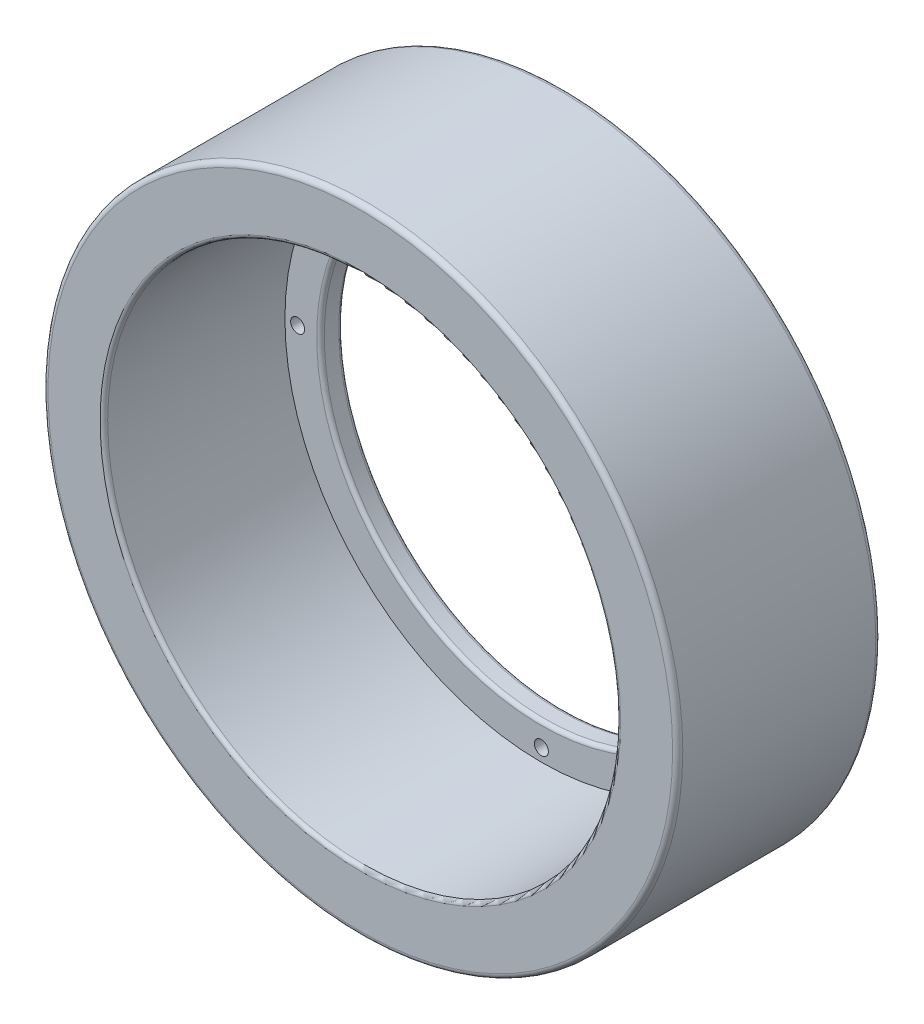
ISO-10303-21;
HEADER;
FILE_DESCRIPTION(('STEP AP214'),'2;1');
FILE_NAME('part.step','',(''),(''),'','','');
FILE_SCHEMA(('AUTOMOTIVE_DESIGN { 1 0 10303 214 1 1 1 1 }'));
ENDSEC;
DATA;
#1=APPLICATION_CONTEXT('core data for automotive mechanical design processes');
#2=APPLICATION_PROTOCOL_DEFINITION('international standard','automotive_design',2000,#1);
#3=PRODUCT_CONTEXT('',#1,'mechanical');
#4=PRODUCT('Part','Part','',(#3));
#5=PRODUCT_RELATED_PRODUCT_CATEGORY('part','',(#4));
#6=PRODUCT_DEFINITION_FORMATION('','',#4);
#7=PRODUCT_DEFINITION_CONTEXT('part definition',#1,'design');
#8=PRODUCT_DEFINITION('design','',#6,#7);
#9=PRODUCT_DEFINITION_SHAPE('','',#8);
#10=(LENGTH_UNIT() NAMED_UNIT(*) SI_UNIT(.MILLI.,.METRE.));
#11=(NAMED_UNIT(*) PLANE_ANGLE_UNIT() SI_UNIT($,.RADIAN.));
#12=(NAMED_UNIT(*) SI_UNIT($,.STERADIAN.) SOLID_ANGLE_UNIT());
#13=UNCERTAINTY_MEASURE_WITH_UNIT(LENGTH_MEASURE(1.E-05),#10,'distance_accuracy_value','');
#14=(GEOMETRIC_REPRESENTATION_CONTEXT(3) GLOBAL_UNCERTAINTY_ASSIGNED_CONTEXT((#13)) GLOBAL_UNIT_ASSIGNED_CONTEXT((#10,
#11,#12)) REPRESENTATION_CONTEXT('',''));
#15=CARTESIAN_POINT('',(0.,0.,0.));
#16=DIRECTION('',(0.,0.,1.));
#17=DIRECTION('',(1.,0.,0.));
#18=AXIS2_PLACEMENT_3D('',#15,#16,#17);
#19=CARTESIAN_POINT('',(0.,0.,80.));
#20=DIRECTION('',(0.,0.,1.));
#21=DIRECTION('',(1.,0.,0.));
#22=AXIS2_PLACEMENT_3D('',#19,#20,#21);
#23=PLANE('',#22);
#24=CARTESIAN_POINT('',(0.,0.,80.));
#25=DIRECTION('',(0.,0.,1.));
#26=DIRECTION('',(1.,0.,0.));
#27=AXIS2_PLACEMENT_3D('',#24,#25,#26);
#28=CIRCLE('',#27,102.5);
#29=CARTESIAN_POINT('',(102.5,0.,80.));
#30=VERTEX_POINT('',#29);
#31=EDGE_CURVE('E10',#30,#30,#28,.F.);
#32=ORIENTED_EDGE('',*,*,#31,.T.);
#33=EDGE_LOOP('',(#32));
#34=FACE_BOUND('',#33,.T.);
#35=CARTESIAN_POINT('',(0.,0.,80.));
#36=DIRECTION('',(0.,0.,1.));
#37=DIRECTION('',(1.,0.,0.));
#38=AXIS2_PLACEMENT_3D('',#35,#36,#37);
#39=CIRCLE('',#38,123.);
#40=CARTESIAN_POINT('',(123.,0.,80.));
#41=VERTEX_POINT('',#40);
#42=EDGE_CURVE('E100',#41,#41,#39,.T.);
#43=ORIENTED_EDGE('',*,*,#42,.T.);
#44=EDGE_LOOP('',(#43));
#45=FACE_BOUND('',#44,.T.);
#46=ADVANCED_FACE('F30',(#34,#45),#23,.T.);
#47=CARTESIAN_POINT('',(0.,0.,0.));
#48=DIRECTION('',(0.,0.,1.));
#49=DIRECTION('',(1.,0.,0.));
#50=AXIS2_PLACEMENT_3D('',#47,#48,#49);
#51=PLANE('',#50);
#52=CARTESIAN_POINT('',(0.,96.,0.));
#53=DIRECTION('',(0.,0.,-1.));
#54=DIRECTION('',(-1.,0.,0.));
#55=AXIS2_PLACEMENT_3D('',#52,#53,#54);
#56=CIRCLE('',#55,6.145);
#57=CARTESIAN_POINT('',(-6.14499999999998,96.,0.));
#58=VERTEX_POINT('',#57);
#59=EDGE_CURVE('E350',#58,#58,#56,.T.);
#60=ORIENTED_EDGE('',*,*,#59,.F.);
#61=EDGE_LOOP('',(#60));
#62=FACE_BOUND('',#61,.T.);
#63=CARTESIAN_POINT('',(-96.,0.,0.));
#64=DIRECTION('',(0.,0.,-1.));
#65=DIRECTION('',(-1.,0.,0.));
#66=AXIS2_PLACEMENT_3D('',#63,#64,#65);
#67=CIRCLE('',#66,6.145);
#68=CARTESIAN_POINT('',(-102.145,0.,0.));
#69=VERTEX_POINT('',#68);
#70=EDGE_CURVE('E360',#69,#69,#67,.T.);
#71=ORIENTED_EDGE('',*,*,#70,.F.);
#72=EDGE_LOOP('',(#71));
#73=FACE_BOUND('',#72,.T.);
#74=CARTESIAN_POINT('',(0.,-96.,0.));
#75=DIRECTION('',(0.,0.,-1.));
#76=DIRECTION('',(-1.,0.,0.));
#77=AXIS2_PLACEMENT_3D('',#74,#75,#76);
#78=CIRCLE('',#77,6.145);
#79=CARTESIAN_POINT('',(-6.145,-96.,0.));
#80=VERTEX_POINT('',#79);
#81=EDGE_CURVE('E58',#80,#80,#78,.T.);
#82=ORIENTED_EDGE('',*,*,#81,.F.);
#83=EDGE_LOOP('',(#82));
#84=FACE_BOUND('',#83,.T.);
#85=CARTESIAN_POINT('',(96.,6.70364417057882E-13,0.));
#86=DIRECTION('',(0.,0.,-1.));
#87=DIRECTION('',(-1.,0.,0.));
#88=AXIS2_PLACEMENT_3D('',#85,#86,#87);
#89=CIRCLE('',#88,6.145);
#90=CARTESIAN_POINT('',(89.855,6.70364417057882E-13,0.));
#91=VERTEX_POINT('',#90);
#92=EDGE_CURVE('E54',#91,#91,#89,.T.);
#93=ORIENTED_EDGE('',*,*,#92,.F.);
#94=EDGE_LOOP('',(#93));
#95=FACE_BOUND('',#94,.T.);
#96=CARTESIAN_POINT('',(0.,0.,0.));
#97=DIRECTION('',(0.,0.,1.));
#98=DIRECTION('',(1.,0.,0.));
#99=AXIS2_PLACEMENT_3D('',#96,#97,#98);
#100=CIRCLE('',#99,88.5);
#101=CARTESIAN_POINT('',(88.5,0.,0.));
#102=VERTEX_POINT('',#101);
#103=EDGE_CURVE('E106',#102,#102,#100,.T.);
#104=ORIENTED_EDGE('',*,*,#103,.T.);
#105=EDGE_LOOP('',(#104));
#106=FACE_BOUND('',#105,.T.);
#107=CARTESIAN_POINT('',(0.,0.,0.));
#108=DIRECTION('',(0.,0.,1.));
#109=DIRECTION('',(1.,0.,0.));
#110=AXIS2_PLACEMENT_3D('',#107,#108,#109);
#111=CIRCLE('',#110,123.);
#112=CARTESIAN_POINT('',(123.,0.,0.));
#113=VERTEX_POINT('',#112);
#114=EDGE_CURVE('E97',#113,#113,#111,.F.);
#115=ORIENTED_EDGE('',*,*,#114,.T.);
#116=EDGE_LOOP('',(#115));
#117=FACE_BOUND('',#116,.T.);
#118=ADVANCED_FACE('F141',(#62,#73,#84,#95,#106,#117),#51,.F.);
#119=CARTESIAN_POINT('',(0.,0.,80.));
#120=DIRECTION('',(0.,0.,-1.));
#121=DIRECTION('',(-1.,0.,0.));
#122=AXIS2_PLACEMENT_3D('',#119,#120,#121);
#123=CYLINDRICAL_SURFACE('',#122,125.);
#124=CARTESIAN_POINT('',(0.,0.,2.));
#125=DIRECTION('',(0.,0.,1.));
#126=DIRECTION('',(1.,0.,0.));
#127=AXIS2_PLACEMENT_3D('',#124,#125,#126);
#128=CIRCLE('',#127,125.);
#129=CARTESIAN_POINT('',(125.,0.,2.));
#130=VERTEX_POINT('',#129);
#131=EDGE_CURVE('E94',#130,#130,#128,.T.);
#132=ORIENTED_EDGE('',*,*,#131,.T.);
#133=EDGE_LOOP('',(#132));
#134=FACE_BOUND('',#133,.T.);
#135=CARTESIAN_POINT('',(0.,0.,78.));
#136=DIRECTION('',(0.,0.,1.));
#137=DIRECTION('',(1.,0.,0.));
#138=AXIS2_PLACEMENT_3D('',#135,#136,#137);
#139=CIRCLE('',#138,125.);
#140=CARTESIAN_POINT('',(125.,0.,78.));
#141=VERTEX_POINT('',#140);
#142=EDGE_CURVE('E50',#141,#141,#139,.F.);
#143=ORIENTED_EDGE('',*,*,#142,.T.);
#144=EDGE_LOOP('',(#143));
#145=FACE_BOUND('',#144,.T.);
#146=ADVANCED_FACE('F146',(#134,#145),#123,.T.);
#147=CARTESIAN_POINT('',(0.,0.,80.));
#148=DIRECTION('',(0.,0.,-1.));
#149=DIRECTION('',(-1.,0.,0.));
#150=AXIS2_PLACEMENT_3D('',#147,#148,#149);
#151=CYLINDRICAL_SURFACE('',#150,101.);
#152=CARTESIAN_POINT('',(0.,0.,78.5));
#153=DIRECTION('',(0.,0.,1.));
#154=DIRECTION('',(1.,0.,0.));
#155=AXIS2_PLACEMENT_3D('',#152,#153,#154);
#156=CIRCLE('',#155,101.);
#157=CARTESIAN_POINT('',(101.,0.,78.5));
#158=VERTEX_POINT('',#157);
#159=EDGE_CURVE('E38',#158,#158,#156,.T.);
#160=ORIENTED_EDGE('',*,*,#159,.T.);
#161=EDGE_LOOP('',(#160));
#162=FACE_BOUND('',#161,.T.);
#163=CARTESIAN_POINT('',(0.,0.,8.7));
#164=DIRECTION('',(0.,0.,1.));
#165=DIRECTION('',(1.,0.,0.));
#166=AXIS2_PLACEMENT_3D('',#163,#164,#165);
#167=CIRCLE('',#166,101.);
#168=CARTESIAN_POINT('',(101.,0.,8.7));
#169=VERTEX_POINT('',#168);
#170=EDGE_CURVE('E103',#169,#169,#167,.T.);
#171=ORIENTED_EDGE('',*,*,#170,.F.);
#172=EDGE_LOOP('',(#171));
#173=FACE_BOUND('',#172,.T.);
#174=ADVANCED_FACE('F151',(#162,#173),#151,.F.);
#175=CARTESIAN_POINT('',(0.,0.,2.));
#176=DIRECTION('',(0.,0.,1.));
#177=DIRECTION('',(1.,0.,0.));
#178=AXIS2_PLACEMENT_3D('',#175,#176,#177);
#179=TOROIDAL_SURFACE('',#178,123.,2.);
#180=ORIENTED_EDGE('',*,*,#114,.F.);
#181=EDGE_LOOP('',(#180));
#182=FACE_BOUND('',#181,.T.);
#183=ORIENTED_EDGE('',*,*,#131,.F.);
#184=EDGE_LOOP('',(#183));
#185=FACE_BOUND('',#184,.T.);
#186=ADVANCED_FACE('F156',(#182,#185),#179,.T.);
#187=CARTESIAN_POINT('',(0.,0.,78.));
#188=DIRECTION('',(0.,0.,1.));
#189=DIRECTION('',(1.,0.,0.));
#190=AXIS2_PLACEMENT_3D('',#187,#188,#189);
#191=TOROIDAL_SURFACE('',#190,123.,2.);
#192=ORIENTED_EDGE('',*,*,#142,.F.);
#193=EDGE_LOOP('',(#192));
#194=FACE_BOUND('',#193,.T.);
#195=ORIENTED_EDGE('',*,*,#42,.F.);
#196=EDGE_LOOP('',(#195));
#197=FACE_BOUND('',#196,.T.);
#198=ADVANCED_FACE('F136',(#194,#197),#191,.T.);
#199=CARTESIAN_POINT('',(0.,0.,8.7));
#200=DIRECTION('',(0.,0.,1.));
#201=DIRECTION('',(1.,0.,0.));
#202=AXIS2_PLACEMENT_3D('',#199,#200,#201);
#203=PLANE('',#202);
#204=CARTESIAN_POINT('',(0.,96.,8.7));
#205=DIRECTION('',(0.,0.,1.));
#206=DIRECTION('',(1.,0.,0.));
#207=AXIS2_PLACEMENT_3D('',#204,#205,#206);
#208=CIRCLE('',#207,2.74999999999999);
#209=CARTESIAN_POINT('',(2.75000000000001,96.,8.7));
#210=VERTEX_POINT('',#209);
#211=EDGE_CURVE('E34',#210,#210,#208,.T.);
#212=ORIENTED_EDGE('',*,*,#211,.F.);
#213=EDGE_LOOP('',(#212));
#214=FACE_BOUND('',#213,.T.);
#215=CARTESIAN_POINT('',(-96.,0.,8.7));
#216=DIRECTION('',(0.,0.,1.));
#217=DIRECTION('',(1.,0.,0.));
#218=AXIS2_PLACEMENT_3D('',#215,#216,#217);
#219=CIRCLE('',#218,2.74999999999999);
#220=CARTESIAN_POINT('',(-93.25,0.,8.7));
#221=VERTEX_POINT('',#220);
#222=EDGE_CURVE('E56',#221,#221,#219,.T.);
#223=ORIENTED_EDGE('',*,*,#222,.F.);
#224=EDGE_LOOP('',(#223));
#225=FACE_BOUND('',#224,.T.);
#226=CARTESIAN_POINT('',(0.,-96.,8.7));
#227=DIRECTION('',(0.,0.,1.));
#228=DIRECTION('',(1.,0.,0.));
#229=AXIS2_PLACEMENT_3D('',#226,#227,#228);
#230=CIRCLE('',#229,2.74999999999999);
#231=CARTESIAN_POINT('',(2.74999999999999,-96.,8.7));
#232=VERTEX_POINT('',#231);
#233=EDGE_CURVE('E52',#232,#232,#230,.T.);
#234=ORIENTED_EDGE('',*,*,#233,.F.);
#235=EDGE_LOOP('',(#234));
#236=FACE_BOUND('',#235,.T.);
#237=CARTESIAN_POINT('',(96.,6.70364417057882E-13,8.7));
#238=DIRECTION('',(0.,0.,1.));
#239=DIRECTION('',(1.,0.,0.));
#240=AXIS2_PLACEMENT_3D('',#237,#238,#239);
#241=CIRCLE('',#240,2.74999999999999);
#242=CARTESIAN_POINT('',(98.75,6.70364417057882E-13,8.7));
#243=VERTEX_POINT('',#242);
#244=EDGE_CURVE('E47',#243,#243,#241,.T.);
#245=ORIENTED_EDGE('',*,*,#244,.F.);
#246=EDGE_LOOP('',(#245));
#247=FACE_BOUND('',#246,.T.);
#248=CARTESIAN_POINT('',(0.,0.,8.7));
#249=DIRECTION('',(0.,0.,1.));
#250=DIRECTION('',(1.,0.,0.));
#251=AXIS2_PLACEMENT_3D('',#248,#249,#250);
#252=CIRCLE('',#251,88.5);
#253=CARTESIAN_POINT('',(88.5,0.,8.7));
#254=VERTEX_POINT('',#253);
#255=EDGE_CURVE('E43',#254,#254,#252,.F.);
#256=ORIENTED_EDGE('',*,*,#255,.T.);
#257=EDGE_LOOP('',(#256));
#258=FACE_BOUND('',#257,.T.);
#259=ORIENTED_EDGE('',*,*,#170,.T.);
#260=EDGE_LOOP('',(#259));
#261=FACE_BOUND('',#260,.T.);
#262=ADVANCED_FACE('F117',(#214,#225,#236,#247,#258,#261),#203,.T.);
#263=CARTESIAN_POINT('',(0.,0.,8.7));
#264=DIRECTION('',(0.,0.,-1.));
#265=DIRECTION('',(-1.,0.,0.));
#266=AXIS2_PLACEMENT_3D('',#263,#264,#265);
#267=CYLINDRICAL_SURFACE('',#266,87.);
#268=CARTESIAN_POINT('',(0.,0.,1.5));
#269=DIRECTION('',(0.,0.,1.));
#270=DIRECTION('',(1.,0.,0.));
#271=AXIS2_PLACEMENT_3D('',#268,#269,#270);
#272=CIRCLE('',#271,87.);
#273=CARTESIAN_POINT('',(87.,0.,1.5));
#274=VERTEX_POINT('',#273);
#275=EDGE_CURVE('E112',#274,#274,#272,.F.);
#276=ORIENTED_EDGE('',*,*,#275,.T.);
#277=EDGE_LOOP('',(#276));
#278=FACE_BOUND('',#277,.T.);
#279=CARTESIAN_POINT('',(0.,0.,7.2));
#280=DIRECTION('',(0.,0.,1.));
#281=DIRECTION('',(1.,0.,0.));
#282=AXIS2_PLACEMENT_3D('',#279,#280,#281);
#283=CIRCLE('',#282,87.);
#284=CARTESIAN_POINT('',(87.,0.,7.2));
#285=VERTEX_POINT('',#284);
#286=EDGE_CURVE('E109',#285,#285,#283,.T.);
#287=ORIENTED_EDGE('',*,*,#286,.T.);
#288=EDGE_LOOP('',(#287));
#289=FACE_BOUND('',#288,.T.);
#290=ADVANCED_FACE('F126',(#278,#289),#267,.F.);
#291=CARTESIAN_POINT('',(0.,0.,1.5));
#292=DIRECTION('',(0.,0.,1.));
#293=DIRECTION('',(1.,0.,0.));
#294=AXIS2_PLACEMENT_3D('',#291,#292,#293);
#295=TOROIDAL_SURFACE('',#294,88.5,1.5);
#296=ORIENTED_EDGE('',*,*,#275,.F.);
#297=EDGE_LOOP('',(#296));
#298=FACE_BOUND('',#297,.T.);
#299=ORIENTED_EDGE('',*,*,#103,.F.);
#300=EDGE_LOOP('',(#299));
#301=FACE_BOUND('',#300,.T.);
#302=ADVANCED_FACE('F123',(#298,#301),#295,.T.);
#303=CARTESIAN_POINT('',(0.,0.,7.2));
#304=DIRECTION('',(0.,0.,1.));
#305=DIRECTION('',(1.,0.,0.));
#306=AXIS2_PLACEMENT_3D('',#303,#304,#305);
#307=TOROIDAL_SURFACE('',#306,88.5,1.5);
#308=ORIENTED_EDGE('',*,*,#255,.F.);
#309=EDGE_LOOP('',(#308));
#310=FACE_BOUND('',#309,.T.);
#311=ORIENTED_EDGE('',*,*,#286,.F.);
#312=EDGE_LOOP('',(#311));
#313=FACE_BOUND('',#312,.T.);
#314=ADVANCED_FACE('F120',(#310,#313),#307,.T.);
#315=CARTESIAN_POINT('',(0.,0.,78.5));
#316=DIRECTION('',(0.,0.,1.));
#317=DIRECTION('',(1.,0.,0.));
#318=AXIS2_PLACEMENT_3D('',#315,#316,#317);
#319=TOROIDAL_SURFACE('',#318,102.5,1.5);
#320=ORIENTED_EDGE('',*,*,#31,.F.);
#321=EDGE_LOOP('',(#320));
#322=FACE_BOUND('',#321,.T.);
#323=ORIENTED_EDGE('',*,*,#159,.F.);
#324=EDGE_LOOP('',(#323));
#325=FACE_BOUND('',#324,.T.);
#326=ADVANCED_FACE('F32',(#322,#325),#319,.T.);
#327=CARTESIAN_POINT('',(96.,6.70364417057882E-13,0.));
#328=DIRECTION('',(0.,0.,-1.));
#329=DIRECTION('',(-1.,0.,0.));
#330=AXIS2_PLACEMENT_3D('',#327,#328,#329);
#331=CYLINDRICAL_SURFACE('',#330,2.74999999999999);
#332=ORIENTED_EDGE('',*,*,#244,.T.);
#333=EDGE_LOOP('',(#332));
#334=FACE_BOUND('',#333,.T.);
#335=CARTESIAN_POINT('',(96.,6.70364417057882E-13,3.58));
#336=DIRECTION('',(0.,0.,-1.));
#337=DIRECTION('',(-1.,0.,0.));
#338=AXIS2_PLACEMENT_3D('',#335,#336,#337);
#339=CIRCLE('',#338,2.75);
#340=CARTESIAN_POINT('',(93.25,6.70364417057882E-13,3.58));
#341=VERTEX_POINT('',#340);
#342=EDGE_CURVE('E51',#341,#341,#339,.T.);
#343=ORIENTED_EDGE('',*,*,#342,.T.);
#344=EDGE_LOOP('',(#343));
#345=FACE_BOUND('',#344,.T.);
#346=ADVANCED_FACE('F185',(#334,#345),#331,.F.);
#347=CARTESIAN_POINT('',(102.12,6.70364417057882E-13,3.58));
#348=DIRECTION('',(0.,0.,1.));
#349=DIRECTION('',(1.,0.,0.));
#350=AXIS2_PLACEMENT_3D('',#347,#348,#349);
#351=PLANE('',#350);
#352=ORIENTED_EDGE('',*,*,#342,.F.);
#353=EDGE_LOOP('',(#352));
#354=FACE_BOUND('',#353,.T.);
#355=CARTESIAN_POINT('',(96.,6.70364417057882E-13,3.58));
#356=DIRECTION('',(0.,0.,-1.));
#357=DIRECTION('',(-1.,0.,0.));
#358=AXIS2_PLACEMENT_3D('',#355,#356,#357);
#359=CIRCLE('',#358,6.12);
#360=CARTESIAN_POINT('',(89.88,6.70364417057882E-13,3.58));
#361=VERTEX_POINT('',#360);
#362=EDGE_CURVE('E87',#361,#361,#359,.T.);
#363=ORIENTED_EDGE('',*,*,#362,.T.);
#364=EDGE_LOOP('',(#363));
#365=FACE_BOUND('',#364,.T.);
#366=ADVANCED_FACE('F190',(#354,#365),#351,.F.);
#367=CARTESIAN_POINT('',(96.,6.70364417057882E-13,0.));
#368=DIRECTION('',(0.,0.,-1.));
#369=DIRECTION('',(-1.,0.,0.));
#370=AXIS2_PLACEMENT_3D('',#367,#368,#369);
#371=CYLINDRICAL_SURFACE('',#370,6.12);
#372=ORIENTED_EDGE('',*,*,#362,.F.);
#373=EDGE_LOOP('',(#372));
#374=FACE_BOUND('',#373,.T.);
#375=CARTESIAN_POINT('',(96.,6.70364417057882E-13,0.0250000000000007));
#376=DIRECTION('',(0.,0.,-1.));
#377=DIRECTION('',(-1.,0.,0.));
#378=AXIS2_PLACEMENT_3D('',#375,#376,#377);
#379=CIRCLE('',#378,6.12);
#380=CARTESIAN_POINT('',(89.88,6.70364417057882E-13,0.0250000000000007));
#381=VERTEX_POINT('',#380);
#382=EDGE_CURVE('E84',#381,#381,#379,.T.);
#383=ORIENTED_EDGE('',*,*,#382,.T.);
#384=EDGE_LOOP('',(#383));
#385=FACE_BOUND('',#384,.T.);
#386=ADVANCED_FACE('F201',(#374,#385),#371,.F.);
#387=CARTESIAN_POINT('',(96.,6.70364417057882E-13,0.));
#388=DIRECTION('',(0.,0.,-1.));
#389=DIRECTION('',(-1.,0.,0.));
#390=AXIS2_PLACEMENT_3D('',#387,#388,#389);
#391=CONICAL_SURFACE('',#390,6.145,0.785398163397328);
#392=ORIENTED_EDGE('',*,*,#382,.F.);
#393=EDGE_LOOP('',(#392));
#394=FACE_BOUND('',#393,.T.);
#395=ORIENTED_EDGE('',*,*,#92,.T.);
#396=EDGE_LOOP('',(#395));
#397=FACE_BOUND('',#396,.T.);
#398=ADVANCED_FACE('F211',(#394,#397),#391,.F.);
#399=CARTESIAN_POINT('',(0.,-96.,0.));
#400=DIRECTION('',(0.,0.,-1.));
#401=DIRECTION('',(-1.,0.,0.));
#402=AXIS2_PLACEMENT_3D('',#399,#400,#401);
#403=CYLINDRICAL_SURFACE('',#402,2.74999999999999);
#404=ORIENTED_EDGE('',*,*,#233,.T.);
#405=EDGE_LOOP('',(#404));
#406=FACE_BOUND('',#405,.T.);
#407=CARTESIAN_POINT('',(0.,-96.,3.58));
#408=DIRECTION('',(0.,0.,-1.));
#409=DIRECTION('',(-1.,0.,0.));
#410=AXIS2_PLACEMENT_3D('',#407,#408,#409);
#411=CIRCLE('',#410,2.75);
#412=CARTESIAN_POINT('',(-2.75,-96.,3.58));
#413=VERTEX_POINT('',#412);
#414=EDGE_CURVE('E55',#413,#413,#411,.T.);
#415=ORIENTED_EDGE('',*,*,#414,.T.);
#416=EDGE_LOOP('',(#415));
#417=FACE_BOUND('',#416,.T.);
#418=ADVANCED_FACE('F221',(#406,#417),#403,.F.);
#419=CARTESIAN_POINT('',(6.12,-96.,3.58));
#420=DIRECTION('',(0.,0.,1.));
#421=DIRECTION('',(1.,0.,0.));
#422=AXIS2_PLACEMENT_3D('',#419,#420,#421);
#423=PLANE('',#422);
#424=ORIENTED_EDGE('',*,*,#414,.F.);
#425=EDGE_LOOP('',(#424));
#426=FACE_BOUND('',#425,.T.);
#427=CARTESIAN_POINT('',(0.,-96.,3.58));
#428=DIRECTION('',(0.,0.,-1.));
#429=DIRECTION('',(-1.,0.,0.));
#430=AXIS2_PLACEMENT_3D('',#427,#428,#429);
#431=CIRCLE('',#430,6.12);
#432=CARTESIAN_POINT('',(-6.12,-96.,3.58));
#433=VERTEX_POINT('',#432);
#434=EDGE_CURVE('E77',#433,#433,#431,.T.);
#435=ORIENTED_EDGE('',*,*,#434,.T.);
#436=EDGE_LOOP('',(#435));
#437=FACE_BOUND('',#436,.T.);
#438=ADVANCED_FACE('F231',(#426,#437),#423,.F.);
#439=CARTESIAN_POINT('',(0.,-96.,0.));
#440=DIRECTION('',(0.,0.,-1.));
#441=DIRECTION('',(-1.,0.,0.));
#442=AXIS2_PLACEMENT_3D('',#439,#440,#441);
#443=CYLINDRICAL_SURFACE('',#442,6.12);
#444=ORIENTED_EDGE('',*,*,#434,.F.);
#445=EDGE_LOOP('',(#444));
#446=FACE_BOUND('',#445,.T.);
#447=CARTESIAN_POINT('',(0.,-96.,0.0250000000000007));
#448=DIRECTION('',(0.,0.,-1.));
#449=DIRECTION('',(-1.,0.,0.));
#450=AXIS2_PLACEMENT_3D('',#447,#448,#449);
#451=CIRCLE('',#450,6.12);
#452=CARTESIAN_POINT('',(-6.12,-96.,0.0250000000000007));
#453=VERTEX_POINT('',#452);
#454=EDGE_CURVE('E63',#453,#453,#451,.T.);
#455=ORIENTED_EDGE('',*,*,#454,.T.);
#456=EDGE_LOOP('',(#455));
#457=FACE_BOUND('',#456,.T.);
#458=ADVANCED_FACE('F241',(#446,#457),#443,.F.);
#459=CARTESIAN_POINT('',(0.,-96.,0.));
#460=DIRECTION('',(0.,0.,-1.));
#461=DIRECTION('',(-1.,0.,0.));
#462=AXIS2_PLACEMENT_3D('',#459,#460,#461);
#463=CONICAL_SURFACE('',#462,6.145,0.785398163397362);
#464=ORIENTED_EDGE('',*,*,#454,.F.);
#465=EDGE_LOOP('',(#464));
#466=FACE_BOUND('',#465,.T.);
#467=ORIENTED_EDGE('',*,*,#81,.T.);
#468=EDGE_LOOP('',(#467));
#469=FACE_BOUND('',#468,.T.);
#470=ADVANCED_FACE('F251',(#466,#469),#463,.F.);
#471=CARTESIAN_POINT('',(-96.,0.,0.));
#472=DIRECTION('',(0.,0.,-1.));
#473=DIRECTION('',(-1.,0.,0.));
#474=AXIS2_PLACEMENT_3D('',#471,#472,#473);
#475=CYLINDRICAL_SURFACE('',#474,2.74999999999999);
#476=ORIENTED_EDGE('',*,*,#222,.T.);
#477=EDGE_LOOP('',(#476));
#478=FACE_BOUND('',#477,.T.);
#479=CARTESIAN_POINT('',(-96.,0.,3.58));
#480=DIRECTION('',(0.,0.,-1.));
#481=DIRECTION('',(-1.,0.,0.));
#482=AXIS2_PLACEMENT_3D('',#479,#480,#481);
#483=CIRCLE('',#482,2.75);
#484=CARTESIAN_POINT('',(-98.75,0.,3.58));
#485=VERTEX_POINT('',#484);
#486=EDGE_CURVE('E59',#485,#485,#483,.T.);
#487=ORIENTED_EDGE('',*,*,#486,.T.);
#488=EDGE_LOOP('',(#487));
#489=FACE_BOUND('',#488,.T.);
#490=ADVANCED_FACE('F261',(#478,#489),#475,.F.);
#491=CARTESIAN_POINT('',(-89.88,0.,3.58));
#492=DIRECTION('',(0.,0.,1.));
#493=DIRECTION('',(1.,0.,0.));
#494=AXIS2_PLACEMENT_3D('',#491,#492,#493);
#495=PLANE('',#494);
#496=ORIENTED_EDGE('',*,*,#486,.F.);
#497=EDGE_LOOP('',(#496));
#498=FACE_BOUND('',#497,.T.);
#499=CARTESIAN_POINT('',(-96.,0.,3.58));
#500=DIRECTION('',(0.,0.,-1.));
#501=DIRECTION('',(-1.,0.,0.));
#502=AXIS2_PLACEMENT_3D('',#499,#500,#501);
#503=CIRCLE('',#502,6.12);
#504=CARTESIAN_POINT('',(-102.12,0.,3.58));
#505=VERTEX_POINT('',#504);
#506=EDGE_CURVE('E66',#505,#505,#503,.T.);
#507=ORIENTED_EDGE('',*,*,#506,.T.);
#508=EDGE_LOOP('',(#507));
#509=FACE_BOUND('',#508,.T.);
#510=ADVANCED_FACE('F271',(#498,#509),#495,.F.);
#511=CARTESIAN_POINT('',(-96.,0.,0.));
#512=DIRECTION('',(0.,0.,-1.));
#513=DIRECTION('',(-1.,0.,0.));
#514=AXIS2_PLACEMENT_3D('',#511,#512,#513);
#515=CYLINDRICAL_SURFACE('',#514,6.12);
#516=ORIENTED_EDGE('',*,*,#506,.F.);
#517=EDGE_LOOP('',(#516));
#518=FACE_BOUND('',#517,.T.);
#519=CARTESIAN_POINT('',(-96.,0.,0.0250000000000007));
#520=DIRECTION('',(0.,0.,-1.));
#521=DIRECTION('',(-1.,0.,0.));
#522=AXIS2_PLACEMENT_3D('',#519,#520,#521);
#523=CIRCLE('',#522,6.12);
#524=CARTESIAN_POINT('',(-102.12,0.,0.0250000000000007));
#525=VERTEX_POINT('',#524);
#526=EDGE_CURVE('E71',#525,#525,#523,.T.);
#527=ORIENTED_EDGE('',*,*,#526,.T.);
#528=EDGE_LOOP('',(#527));
#529=FACE_BOUND('',#528,.T.);
#530=ADVANCED_FACE('F280',(#518,#529),#515,.F.);
#531=CARTESIAN_POINT('',(-96.,0.,0.));
#532=DIRECTION('',(0.,0.,-1.));
#533=DIRECTION('',(-1.,0.,0.));
#534=AXIS2_PLACEMENT_3D('',#531,#532,#533);
#535=CONICAL_SURFACE('',#534,6.145,0.785398163397328);
#536=ORIENTED_EDGE('',*,*,#526,.F.);
#537=EDGE_LOOP('',(#536));
#538=FACE_BOUND('',#537,.T.);
#539=ORIENTED_EDGE('',*,*,#70,.T.);
#540=EDGE_LOOP('',(#539));
#541=FACE_BOUND('',#540,.T.);
#542=ADVANCED_FACE('F290',(#538,#541),#535,.F.);
#543=CARTESIAN_POINT('',(0.,96.,0.));
#544=DIRECTION('',(0.,0.,-1.));
#545=DIRECTION('',(-1.,0.,0.));
#546=AXIS2_PLACEMENT_3D('',#543,#544,#545);
#547=CYLINDRICAL_SURFACE('',#546,2.74999999999999);
#548=ORIENTED_EDGE('',*,*,#211,.T.);
#549=EDGE_LOOP('',(#548));
#550=FACE_BOUND('',#549,.T.);
#551=CARTESIAN_POINT('',(0.,96.,3.58));
#552=DIRECTION('',(0.,0.,-1.));
#553=DIRECTION('',(-1.,0.,0.));
#554=AXIS2_PLACEMENT_3D('',#551,#552,#553);
#555=CIRCLE('',#554,2.75);
#556=CARTESIAN_POINT('',(-2.74999999999998,96.,3.58));
#557=VERTEX_POINT('',#556);
#558=EDGE_CURVE('E357',#557,#557,#555,.T.);
#559=ORIENTED_EDGE('',*,*,#558,.T.);
#560=EDGE_LOOP('',(#559));
#561=FACE_BOUND('',#560,.T.);
#562=ADVANCED_FACE('F300',(#550,#561),#547,.F.);
#563=CARTESIAN_POINT('',(6.12000000000001,96.,3.58));
#564=DIRECTION('',(0.,0.,1.));
#565=DIRECTION('',(1.,0.,0.));
#566=AXIS2_PLACEMENT_3D('',#563,#564,#565);
#567=PLANE('',#566);
#568=ORIENTED_EDGE('',*,*,#558,.F.);
#569=EDGE_LOOP('',(#568));
#570=FACE_BOUND('',#569,.T.);
#571=CARTESIAN_POINT('',(0.,96.,3.58));
#572=DIRECTION('',(0.,0.,-1.));
#573=DIRECTION('',(-1.,0.,0.));
#574=AXIS2_PLACEMENT_3D('',#571,#572,#573);
#575=CIRCLE('',#574,6.12);
#576=CARTESIAN_POINT('',(-6.11999999999998,96.,3.58));
#577=VERTEX_POINT('',#576);
#578=EDGE_CURVE('E352',#577,#577,#575,.T.);
#579=ORIENTED_EDGE('',*,*,#578,.T.);
#580=EDGE_LOOP('',(#579));
#581=FACE_BOUND('',#580,.T.);
#582=ADVANCED_FACE('F310',(#570,#581),#567,.F.);
#583=CARTESIAN_POINT('',(0.,96.,0.));
#584=DIRECTION('',(0.,0.,-1.));
#585=DIRECTION('',(-1.,0.,0.));
#586=AXIS2_PLACEMENT_3D('',#583,#584,#585);
#587=CYLINDRICAL_SURFACE('',#586,6.12);
#588=ORIENTED_EDGE('',*,*,#578,.F.);
#589=EDGE_LOOP('',(#588));
#590=FACE_BOUND('',#589,.T.);
#591=CARTESIAN_POINT('',(0.,96.,0.0250000000000007));
#592=DIRECTION('',(0.,0.,-1.));
#593=DIRECTION('',(-1.,0.,0.));
#594=AXIS2_PLACEMENT_3D('',#591,#592,#593);
#595=CIRCLE('',#594,6.12);
#596=CARTESIAN_POINT('',(-6.11999999999998,96.,0.0250000000000007));
#597=VERTEX_POINT('',#596);
#598=EDGE_CURVE('E347',#597,#597,#595,.T.);
#599=ORIENTED_EDGE('',*,*,#598,.T.);
#600=EDGE_LOOP('',(#599));
#601=FACE_BOUND('',#600,.T.);
#602=ADVANCED_FACE('F320',(#590,#601),#587,.F.);
#603=CARTESIAN_POINT('',(0.,96.,0.));
#604=DIRECTION('',(0.,0.,-1.));
#605=DIRECTION('',(-1.,0.,0.));
#606=AXIS2_PLACEMENT_3D('',#603,#604,#605);
#607=CONICAL_SURFACE('',#606,6.145,0.785398163397362);
#608=ORIENTED_EDGE('',*,*,#598,.F.);
#609=EDGE_LOOP('',(#608));
#610=FACE_BOUND('',#609,.T.);
#611=ORIENTED_EDGE('',*,*,#59,.T.);
#612=EDGE_LOOP('',(#611));
#613=FACE_BOUND('',#612,.T.);
#614=ADVANCED_FACE('F330',(#610,#613),#607,.F.);
#615=CLOSED_SHELL('',(#46,#118,#146,#174,#186,#198,#262,#290,#302,#314,#326,#346,#366,#386,#398,
#418,#438,#458,#470,#490,#510,#530,#542,#562,#582,#602,#614));
#616=MANIFOLD_SOLID_BREP('B2',#615);
#617=ADVANCED_BREP_SHAPE_REPRESENTATION('',(#18,#616),#14);
#618=SHAPE_DEFINITION_REPRESENTATION(#9,#617);
ENDSEC;
END-ISO-10303-21;
